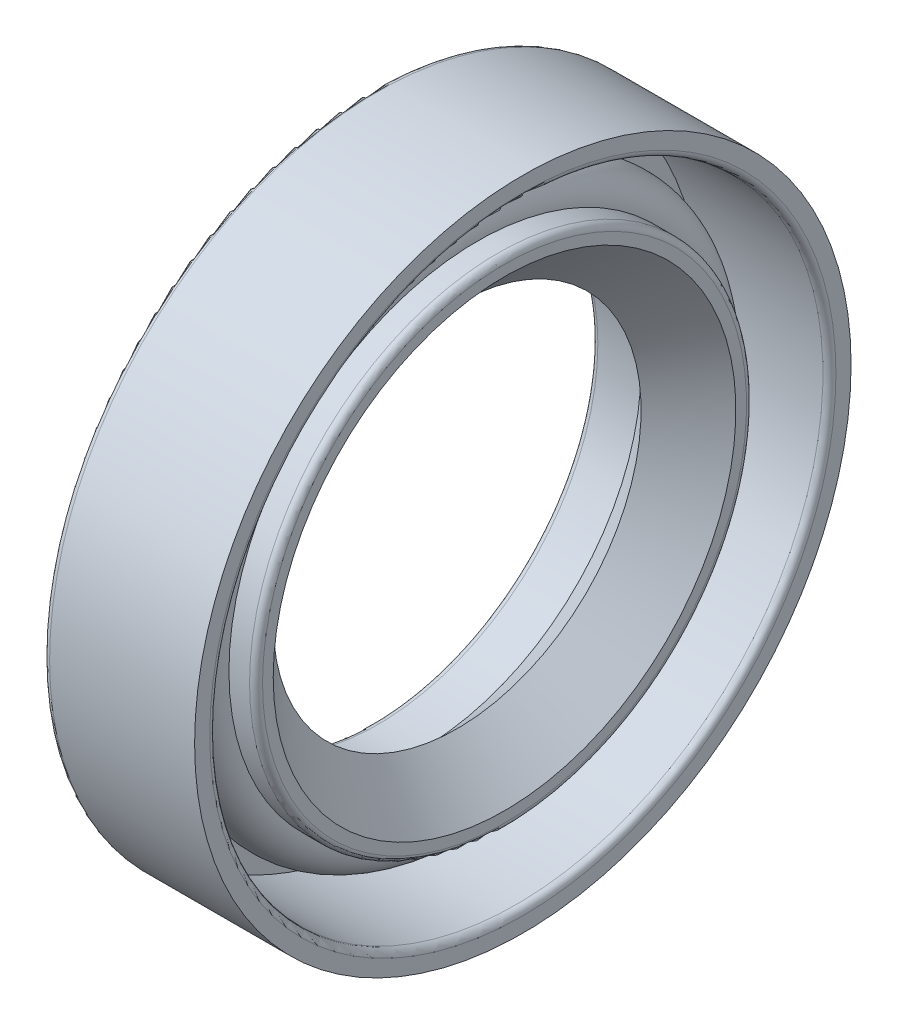
ISO-10303-21;
HEADER;
FILE_DESCRIPTION(('STEP AP214'),'2;1');
FILE_NAME('part.step','',(''),(''),'','','');
FILE_SCHEMA(('AUTOMOTIVE_DESIGN { 1 0 10303 214 1 1 1 1 }'));
ENDSEC;
DATA;
#1=APPLICATION_CONTEXT('core data for automotive mechanical design processes');
#2=APPLICATION_PROTOCOL_DEFINITION('international standard','automotive_design',2000,#1);
#3=PRODUCT_CONTEXT('',#1,'mechanical');
#4=PRODUCT('Part','Part','',(#3));
#5=PRODUCT_RELATED_PRODUCT_CATEGORY('part','',(#4));
#6=PRODUCT_DEFINITION_FORMATION('','',#4);
#7=PRODUCT_DEFINITION_CONTEXT('part definition',#1,'design');
#8=PRODUCT_DEFINITION('design','',#6,#7);
#9=PRODUCT_DEFINITION_SHAPE('','',#8);
#10=(LENGTH_UNIT() NAMED_UNIT(*) SI_UNIT(.MILLI.,.METRE.));
#11=(NAMED_UNIT(*) PLANE_ANGLE_UNIT() SI_UNIT($,.RADIAN.));
#12=(NAMED_UNIT(*) SI_UNIT($,.STERADIAN.) SOLID_ANGLE_UNIT());
#13=UNCERTAINTY_MEASURE_WITH_UNIT(LENGTH_MEASURE(1.E-05),#10,'distance_accuracy_value','');
#14=(GEOMETRIC_REPRESENTATION_CONTEXT(3) GLOBAL_UNCERTAINTY_ASSIGNED_CONTEXT((#13)) GLOBAL_UNIT_ASSIGNED_CONTEXT((#10,
#11,#12)) REPRESENTATION_CONTEXT('',''));
#15=CARTESIAN_POINT('',(0.,0.,0.));
#16=DIRECTION('',(0.,0.,1.));
#17=DIRECTION('',(1.,0.,0.));
#18=AXIS2_PLACEMENT_3D('',#15,#16,#17);
#19=CARTESIAN_POINT('',(7.,14.4671623563866,0.));
#20=DIRECTION('',(-1.,0.,0.));
#21=DIRECTION('',(0.,0.,1.));
#22=AXIS2_PLACEMENT_3D('',#19,#20,#21);
#23=PLANE('',#22);
#24=CARTESIAN_POINT('',(7.,0.,0.));
#25=DIRECTION('',(-1.,0.,0.));
#26=DIRECTION('',(0.,0.,1.));
#27=AXIS2_PLACEMENT_3D('',#24,#25,#26);
#28=CIRCLE('',#27,15.1671623563866);
#29=CARTESIAN_POINT('',(7.,0.,15.1671623563866));
#30=VERTEX_POINT('',#29);
#31=EDGE_CURVE('E108',#30,#30,#28,.T.);
#32=ORIENTED_EDGE('',*,*,#31,.F.);
#33=EDGE_LOOP('',(#32));
#34=FACE_BOUND('',#33,.T.);
#35=CARTESIAN_POINT('',(7.,0.,0.));
#36=DIRECTION('',(-1.,0.,0.));
#37=DIRECTION('',(0.,0.,1.));
#38=AXIS2_PLACEMENT_3D('',#35,#36,#37);
#39=CIRCLE('',#38,14.4671623563866);
#40=CARTESIAN_POINT('',(7.,0.,14.4671623563866));
#41=VERTEX_POINT('',#40);
#42=EDGE_CURVE('E10',#41,#41,#39,.T.);
#43=ORIENTED_EDGE('',*,*,#42,.T.);
#44=EDGE_LOOP('',(#43));
#45=FACE_BOUND('',#44,.T.);
#46=ADVANCED_FACE('F41',(#34,#45),#23,.F.);
#47=CARTESIAN_POINT('',(6.7,0.,0.));
#48=DIRECTION('',(-1.,0.,0.));
#49=DIRECTION('',(0.,0.,1.));
#50=AXIS2_PLACEMENT_3D('',#47,#48,#49);
#51=TOROIDAL_SURFACE('',#50,14.4671623563866,0.3);
#52=ORIENTED_EDGE('',*,*,#42,.F.);
#53=EDGE_LOOP('',(#52));
#54=FACE_BOUND('',#53,.T.);
#55=CARTESIAN_POINT('',(6.7,0.,0.));
#56=DIRECTION('',(-1.,0.,0.));
#57=DIRECTION('',(0.,0.,1.));
#58=AXIS2_PLACEMENT_3D('',#55,#56,#57);
#59=CIRCLE('',#58,14.1671623563866);
#60=CARTESIAN_POINT('',(6.7,0.,14.1671623563866));
#61=VERTEX_POINT('',#60);
#62=EDGE_CURVE('E48',#61,#61,#59,.T.);
#63=ORIENTED_EDGE('',*,*,#62,.T.);
#64=EDGE_LOOP('',(#63));
#65=FACE_BOUND('',#64,.T.);
#66=ADVANCED_FACE('F116',(#54,#65),#51,.T.);
#67=CARTESIAN_POINT('',(0.,0.,0.));
#68=DIRECTION('',(-1.,0.,0.));
#69=DIRECTION('',(0.,0.,1.));
#70=AXIS2_PLACEMENT_3D('',#67,#68,#69);
#71=CYLINDRICAL_SURFACE('',#70,14.1671623563866);
#72=ORIENTED_EDGE('',*,*,#62,.F.);
#73=EDGE_LOOP('',(#72));
#74=FACE_BOUND('',#73,.T.);
#75=CARTESIAN_POINT('',(0.999999999999999,0.,0.));
#76=DIRECTION('',(-1.,0.,0.));
#77=DIRECTION('',(0.,0.,1.));
#78=AXIS2_PLACEMENT_3D('',#75,#76,#77);
#79=CIRCLE('',#78,14.1671623563866);
#80=CARTESIAN_POINT('',(0.999999999999999,0.,14.1671623563866));
#81=VERTEX_POINT('',#80);
#82=EDGE_CURVE('E53',#81,#81,#79,.T.);
#83=ORIENTED_EDGE('',*,*,#82,.T.);
#84=EDGE_LOOP('',(#83));
#85=FACE_BOUND('',#84,.T.);
#86=ADVANCED_FACE('F120',(#74,#85),#71,.F.);
#87=CARTESIAN_POINT('',(0.999999999999999,11.6671623563866,0.));
#88=DIRECTION('',(-1.,0.,0.));
#89=DIRECTION('',(0.,0.,1.));
#90=AXIS2_PLACEMENT_3D('',#87,#88,#89);
#91=PLANE('',#90);
#92=ORIENTED_EDGE('',*,*,#82,.F.);
#93=EDGE_LOOP('',(#92));
#94=FACE_BOUND('',#93,.T.);
#95=CARTESIAN_POINT('',(1.,0.,0.));
#96=DIRECTION('',(-1.,0.,0.));
#97=DIRECTION('',(0.,0.,1.));
#98=AXIS2_PLACEMENT_3D('',#95,#96,#97);
#99=CIRCLE('',#98,11.6671623563866);
#100=CARTESIAN_POINT('',(1.,0.,11.6671623563866));
#101=VERTEX_POINT('',#100);
#102=EDGE_CURVE('E58',#101,#101,#99,.T.);
#103=ORIENTED_EDGE('',*,*,#102,.T.);
#104=EDGE_LOOP('',(#103));
#105=FACE_BOUND('',#104,.T.);
#106=ADVANCED_FACE('F125',(#94,#105),#91,.F.);
#107=CARTESIAN_POINT('',(0.,0.,0.));
#108=DIRECTION('',(-1.,0.,0.));
#109=DIRECTION('',(0.,0.,1.));
#110=AXIS2_PLACEMENT_3D('',#107,#108,#109);
#111=CYLINDRICAL_SURFACE('',#110,11.6671623563866);
#112=ORIENTED_EDGE('',*,*,#102,.F.);
#113=EDGE_LOOP('',(#112));
#114=FACE_BOUND('',#113,.T.);
#115=CARTESIAN_POINT('',(2.29758149316511,0.,0.));
#116=DIRECTION('',(-1.,0.,0.));
#117=DIRECTION('',(0.,0.,1.));
#118=AXIS2_PLACEMENT_3D('',#115,#116,#117);
#119=CIRCLE('',#118,11.6671623563866);
#120=CARTESIAN_POINT('',(2.29758149316511,0.,11.6671623563866));
#121=VERTEX_POINT('',#120);
#122=EDGE_CURVE('E64',#121,#121,#119,.T.);
#123=ORIENTED_EDGE('',*,*,#122,.T.);
#124=EDGE_LOOP('',(#123));
#125=FACE_BOUND('',#124,.T.);
#126=ADVANCED_FACE('F131',(#114,#125),#111,.T.);
#127=CARTESIAN_POINT('',(3.5997031243911,0.,0.));
#128=DIRECTION('',(-1.,0.,0.));
#129=DIRECTION('',(0.,0.,1.));
#130=AXIS2_PLACEMENT_3D('',#127,#128,#129);
#131=TOROIDAL_SURFACE('',#130,11.5748911448205,1.30538680818771);
#132=ORIENTED_EDGE('',*,*,#122,.F.);
#133=EDGE_LOOP('',(#132));
#134=FACE_BOUND('',#133,.T.);
#135=CARTESIAN_POINT('',(4.90182475561708,0.,0.));
#136=DIRECTION('',(-1.,0.,0.));
#137=DIRECTION('',(0.,0.,1.));
#138=AXIS2_PLACEMENT_3D('',#135,#136,#137);
#139=CIRCLE('',#138,11.4826199332544);
#140=CARTESIAN_POINT('',(4.90182475561708,0.,11.4826199332544));
#141=VERTEX_POINT('',#140);
#142=EDGE_CURVE('E68',#141,#141,#139,.T.);
#143=ORIENTED_EDGE('',*,*,#142,.T.);
#144=EDGE_LOOP('',(#143));
#145=FACE_BOUND('',#144,.T.);
#146=ADVANCED_FACE('F135',(#134,#145),#131,.T.);
#147=CARTESIAN_POINT('',(0.,0.,0.));
#148=DIRECTION('',(-1.,0.,0.));
#149=DIRECTION('',(0.,0.,1.));
#150=AXIS2_PLACEMENT_3D('',#147,#148,#149);
#151=CYLINDRICAL_SURFACE('',#150,11.4826199332544);
#152=ORIENTED_EDGE('',*,*,#142,.F.);
#153=EDGE_LOOP('',(#152));
#154=FACE_BOUND('',#153,.T.);
#155=CARTESIAN_POINT('',(5.85396612856203,0.,0.));
#156=DIRECTION('',(-1.,0.,0.));
#157=DIRECTION('',(0.,0.,1.));
#158=AXIS2_PLACEMENT_3D('',#155,#156,#157);
#159=CIRCLE('',#158,11.4826199332544);
#160=CARTESIAN_POINT('',(5.85396612856203,0.,11.4826199332544));
#161=VERTEX_POINT('',#160);
#162=EDGE_CURVE('E72',#161,#161,#159,.T.);
#163=ORIENTED_EDGE('',*,*,#162,.T.);
#164=EDGE_LOOP('',(#163));
#165=FACE_BOUND('',#164,.T.);
#166=ADVANCED_FACE('F139',(#154,#165),#151,.T.);
#167=CARTESIAN_POINT('',(5.85396612856203,0.,0.));
#168=DIRECTION('',(-1.,0.,0.));
#169=DIRECTION('',(0.,0.,1.));
#170=AXIS2_PLACEMENT_3D('',#167,#168,#169);
#171=TOROIDAL_SURFACE('',#170,11.1826199332544,0.3);
#172=ORIENTED_EDGE('',*,*,#162,.F.);
#173=EDGE_LOOP('',(#172));
#174=FACE_BOUND('',#173,.T.);
#175=CARTESIAN_POINT('',(6.15396612856203,0.,0.));
#176=DIRECTION('',(-1.,0.,0.));
#177=DIRECTION('',(0.,0.,1.));
#178=AXIS2_PLACEMENT_3D('',#175,#176,#177);
#179=CIRCLE('',#178,11.1826199332544);
#180=CARTESIAN_POINT('',(6.15396612856203,0.,11.1826199332544));
#181=VERTEX_POINT('',#180);
#182=EDGE_CURVE('E76',#181,#181,#179,.T.);
#183=ORIENTED_EDGE('',*,*,#182,.T.);
#184=EDGE_LOOP('',(#183));
#185=FACE_BOUND('',#184,.T.);
#186=ADVANCED_FACE('F143',(#174,#185),#171,.T.);
#187=CARTESIAN_POINT('',(6.15396612856203,10.6892222790103,0.));
#188=DIRECTION('',(-1.,0.,0.));
#189=DIRECTION('',(0.,0.,1.));
#190=AXIS2_PLACEMENT_3D('',#187,#188,#189);
#191=PLANE('',#190);
#192=ORIENTED_EDGE('',*,*,#182,.F.);
#193=EDGE_LOOP('',(#192));
#194=FACE_BOUND('',#193,.T.);
#195=CARTESIAN_POINT('',(6.15396612856203,0.,0.));
#196=DIRECTION('',(-1.,0.,0.));
#197=DIRECTION('',(0.,0.,1.));
#198=AXIS2_PLACEMENT_3D('',#195,#196,#197);
#199=CIRCLE('',#198,10.6892222790103);
#200=CARTESIAN_POINT('',(6.15396612856203,0.,10.6892222790103));
#201=VERTEX_POINT('',#200);
#202=EDGE_CURVE('E80',#201,#201,#199,.T.);
#203=ORIENTED_EDGE('',*,*,#202,.T.);
#204=EDGE_LOOP('',(#203));
#205=FACE_BOUND('',#204,.T.);
#206=ADVANCED_FACE('F147',(#194,#205),#191,.F.);
#207=CARTESIAN_POINT('',(3.96474384955168,0.,0.));
#208=DIRECTION('',(1.,0.,0.));
#209=DIRECTION('',(0.,0.,-1.));
#210=AXIS2_PLACEMENT_3D('',#207,#208,#209);
#211=CONICAL_SURFACE('',#210,8.5,0.785398163397448);
#212=ORIENTED_EDGE('',*,*,#202,.F.);
#213=EDGE_LOOP('',(#212));
#214=FACE_BOUND('',#213,.T.);
#215=CARTESIAN_POINT('',(3.96474384955168,0.,0.));
#216=DIRECTION('',(-1.,0.,0.));
#217=DIRECTION('',(0.,0.,1.));
#218=AXIS2_PLACEMENT_3D('',#215,#216,#217);
#219=CIRCLE('',#218,8.5);
#220=CARTESIAN_POINT('',(3.96474384955168,0.,8.5));
#221=VERTEX_POINT('',#220);
#222=EDGE_CURVE('E84',#221,#221,#219,.T.);
#223=ORIENTED_EDGE('',*,*,#222,.T.);
#224=EDGE_LOOP('',(#223));
#225=FACE_BOUND('',#224,.T.);
#226=ADVANCED_FACE('F151',(#214,#225),#211,.F.);
#227=CARTESIAN_POINT('',(2.29758149316511,0.,0.));
#228=DIRECTION('',(-1.,0.,0.));
#229=DIRECTION('',(0.,0.,1.));
#230=AXIS2_PLACEMENT_3D('',#227,#228,#229);
#231=CONICAL_SURFACE('',#230,10.1671623563866,0.785398163397448);
#232=ORIENTED_EDGE('',*,*,#222,.F.);
#233=EDGE_LOOP('',(#232));
#234=FACE_BOUND('',#233,.T.);
#235=CARTESIAN_POINT('',(2.29758149316511,0.,0.));
#236=DIRECTION('',(-1.,0.,0.));
#237=DIRECTION('',(0.,0.,1.));
#238=AXIS2_PLACEMENT_3D('',#235,#236,#237);
#239=CIRCLE('',#238,10.1671623563866);
#240=CARTESIAN_POINT('',(2.29758149316511,0.,10.1671623563866));
#241=VERTEX_POINT('',#240);
#242=EDGE_CURVE('E88',#241,#241,#239,.T.);
#243=ORIENTED_EDGE('',*,*,#242,.T.);
#244=EDGE_LOOP('',(#243));
#245=FACE_BOUND('',#244,.T.);
#246=ADVANCED_FACE('F155',(#234,#245),#231,.F.);
#247=CARTESIAN_POINT('',(0.,0.,0.));
#248=DIRECTION('',(-1.,0.,0.));
#249=DIRECTION('',(0.,0.,1.));
#250=AXIS2_PLACEMENT_3D('',#247,#248,#249);
#251=CYLINDRICAL_SURFACE('',#250,10.1671623563866);
#252=ORIENTED_EDGE('',*,*,#242,.F.);
#253=EDGE_LOOP('',(#252));
#254=FACE_BOUND('',#253,.T.);
#255=CARTESIAN_POINT('',(0.300000000000002,0.,0.));
#256=DIRECTION('',(-1.,0.,0.));
#257=DIRECTION('',(0.,0.,1.));
#258=AXIS2_PLACEMENT_3D('',#255,#256,#257);
#259=CIRCLE('',#258,10.1671623563866);
#260=CARTESIAN_POINT('',(0.300000000000002,0.,10.1671623563866));
#261=VERTEX_POINT('',#260);
#262=EDGE_CURVE('E92',#261,#261,#259,.T.);
#263=ORIENTED_EDGE('',*,*,#262,.T.);
#264=EDGE_LOOP('',(#263));
#265=FACE_BOUND('',#264,.T.);
#266=ADVANCED_FACE('F159',(#254,#265),#251,.F.);
#267=CARTESIAN_POINT('',(0.3,0.,0.));
#268=DIRECTION('',(-1.,0.,0.));
#269=DIRECTION('',(0.,0.,1.));
#270=AXIS2_PLACEMENT_3D('',#267,#268,#269);
#271=TOROIDAL_SURFACE('',#270,10.4671623563866,0.3);
#272=ORIENTED_EDGE('',*,*,#262,.F.);
#273=EDGE_LOOP('',(#272));
#274=FACE_BOUND('',#273,.T.);
#275=CARTESIAN_POINT('',(0.,0.,0.));
#276=DIRECTION('',(-1.,0.,0.));
#277=DIRECTION('',(0.,0.,1.));
#278=AXIS2_PLACEMENT_3D('',#275,#276,#277);
#279=CIRCLE('',#278,10.4671623563866);
#280=CARTESIAN_POINT('',(0.,0.,10.4671623563866));
#281=VERTEX_POINT('',#280);
#282=EDGE_CURVE('E96',#281,#281,#279,.T.);
#283=ORIENTED_EDGE('',*,*,#282,.T.);
#284=EDGE_LOOP('',(#283));
#285=FACE_BOUND('',#284,.T.);
#286=ADVANCED_FACE('F163',(#274,#285),#271,.T.);
#287=CARTESIAN_POINT('',(0.,14.8671623563866,0.));
#288=DIRECTION('',(1.,0.,0.));
#289=DIRECTION('',(0.,0.,-1.));
#290=AXIS2_PLACEMENT_3D('',#287,#288,#289);
#291=PLANE('',#290);
#292=ORIENTED_EDGE('',*,*,#282,.F.);
#293=EDGE_LOOP('',(#292));
#294=FACE_BOUND('',#293,.T.);
#295=CARTESIAN_POINT('',(0.,0.,0.));
#296=DIRECTION('',(-1.,0.,0.));
#297=DIRECTION('',(0.,0.,1.));
#298=AXIS2_PLACEMENT_3D('',#295,#296,#297);
#299=CIRCLE('',#298,14.8671623563866);
#300=CARTESIAN_POINT('',(0.,0.,14.8671623563866));
#301=VERTEX_POINT('',#300);
#302=EDGE_CURVE('E100',#301,#301,#299,.T.);
#303=ORIENTED_EDGE('',*,*,#302,.T.);
#304=EDGE_LOOP('',(#303));
#305=FACE_BOUND('',#304,.T.);
#306=ADVANCED_FACE('F167',(#294,#305),#291,.F.);
#307=CARTESIAN_POINT('',(0.3,0.,0.));
#308=DIRECTION('',(-1.,0.,0.));
#309=DIRECTION('',(0.,0.,1.));
#310=AXIS2_PLACEMENT_3D('',#307,#308,#309);
#311=TOROIDAL_SURFACE('',#310,14.8671623563866,0.3);
#312=ORIENTED_EDGE('',*,*,#302,.F.);
#313=EDGE_LOOP('',(#312));
#314=FACE_BOUND('',#313,.T.);
#315=CARTESIAN_POINT('',(0.300000000000002,0.,0.));
#316=DIRECTION('',(-1.,0.,0.));
#317=DIRECTION('',(0.,0.,1.));
#318=AXIS2_PLACEMENT_3D('',#315,#316,#317);
#319=CIRCLE('',#318,15.1671623563866);
#320=CARTESIAN_POINT('',(0.300000000000002,0.,15.1671623563866));
#321=VERTEX_POINT('',#320);
#322=EDGE_CURVE('E104',#321,#321,#319,.T.);
#323=ORIENTED_EDGE('',*,*,#322,.T.);
#324=EDGE_LOOP('',(#323));
#325=FACE_BOUND('',#324,.T.);
#326=ADVANCED_FACE('F171',(#314,#325),#311,.T.);
#327=CARTESIAN_POINT('',(0.,0.,0.));
#328=DIRECTION('',(-1.,0.,0.));
#329=DIRECTION('',(0.,0.,1.));
#330=AXIS2_PLACEMENT_3D('',#327,#328,#329);
#331=CYLINDRICAL_SURFACE('',#330,15.1671623563866);
#332=ORIENTED_EDGE('',*,*,#322,.F.);
#333=EDGE_LOOP('',(#332));
#334=FACE_BOUND('',#333,.T.);
#335=ORIENTED_EDGE('',*,*,#31,.T.);
#336=EDGE_LOOP('',(#335));
#337=FACE_BOUND('',#336,.T.);
#338=ADVANCED_FACE('F113',(#334,#337),#331,.T.);
#339=CLOSED_SHELL('',(#46,#66,#86,#106,#126,#146,#166,#186,#206,#226,#246,#266,#286,#306,#326,#338));
#340=MANIFOLD_SOLID_BREP('B2',#339);
#341=ADVANCED_BREP_SHAPE_REPRESENTATION('',(#18,#340),#14);
#342=SHAPE_DEFINITION_REPRESENTATION(#9,#341);
ENDSEC;
END-ISO-10303-21;
